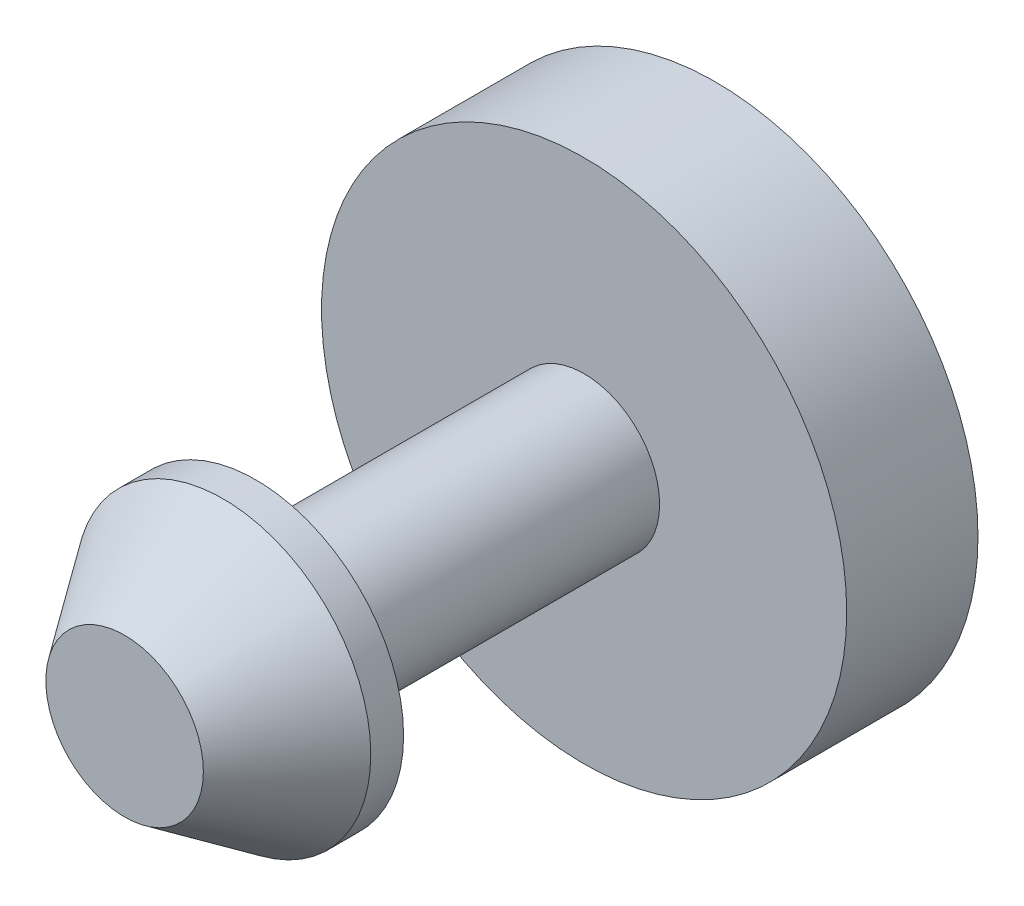
ISO-10303-21;
HEADER;
FILE_DESCRIPTION(('STEP AP214'),'2;1');
FILE_NAME('part.step','',(''),(''),'','','');
FILE_SCHEMA(('AUTOMOTIVE_DESIGN { 1 0 10303 214 1 1 1 1 }'));
ENDSEC;
DATA;
#1=APPLICATION_CONTEXT('core data for automotive mechanical design processes');
#2=APPLICATION_PROTOCOL_DEFINITION('international standard','automotive_design',2000,#1);
#3=PRODUCT_CONTEXT('',#1,'mechanical');
#4=PRODUCT('Part','Part','',(#3));
#5=PRODUCT_RELATED_PRODUCT_CATEGORY('part','',(#4));
#6=PRODUCT_DEFINITION_FORMATION('','',#4);
#7=PRODUCT_DEFINITION_CONTEXT('part definition',#1,'design');
#8=PRODUCT_DEFINITION('design','',#6,#7);
#9=PRODUCT_DEFINITION_SHAPE('','',#8);
#10=(LENGTH_UNIT() NAMED_UNIT(*) SI_UNIT(.MILLI.,.METRE.));
#11=(NAMED_UNIT(*) PLANE_ANGLE_UNIT() SI_UNIT($,.RADIAN.));
#12=(NAMED_UNIT(*) SI_UNIT($,.STERADIAN.) SOLID_ANGLE_UNIT());
#13=UNCERTAINTY_MEASURE_WITH_UNIT(LENGTH_MEASURE(1.E-05),#10,'distance_accuracy_value','');
#14=(GEOMETRIC_REPRESENTATION_CONTEXT(3) GLOBAL_UNCERTAINTY_ASSIGNED_CONTEXT((#13)) GLOBAL_UNIT_ASSIGNED_CONTEXT((#10,
#11,#12)) REPRESENTATION_CONTEXT('',''));
#15=CARTESIAN_POINT('',(0.,0.,0.));
#16=DIRECTION('',(0.,0.,1.));
#17=DIRECTION('',(1.,0.,0.));
#18=AXIS2_PLACEMENT_3D('',#15,#16,#17);
#19=CARTESIAN_POINT('',(0.,0.,2.));
#20=DIRECTION('',(0.,0.,-1.));
#21=DIRECTION('',(-1.,0.,0.));
#22=AXIS2_PLACEMENT_3D('',#19,#20,#21);
#23=CYLINDRICAL_SURFACE('',#22,4.);
#24=CARTESIAN_POINT('',(0.,0.,2.));
#25=DIRECTION('',(0.,0.,1.));
#26=DIRECTION('',(1.,0.,0.));
#27=AXIS2_PLACEMENT_3D('',#24,#25,#26);
#28=CIRCLE('',#27,4.);
#29=CARTESIAN_POINT('',(4.,0.,2.));
#30=VERTEX_POINT('',#29);
#31=EDGE_CURVE('E45',#30,#30,#28,.T.);
#32=ORIENTED_EDGE('',*,*,#31,.F.);
#33=EDGE_LOOP('',(#32));
#34=FACE_BOUND('',#33,.T.);
#35=CARTESIAN_POINT('',(0.,0.,0.));
#36=DIRECTION('',(0.,0.,1.));
#37=DIRECTION('',(1.,0.,0.));
#38=AXIS2_PLACEMENT_3D('',#35,#36,#37);
#39=CIRCLE('',#38,4.);
#40=CARTESIAN_POINT('',(4.,0.,0.));
#41=VERTEX_POINT('',#40);
#42=EDGE_CURVE('E40',#41,#41,#39,.T.);
#43=ORIENTED_EDGE('',*,*,#42,.T.);
#44=EDGE_LOOP('',(#43));
#45=FACE_BOUND('',#44,.T.);
#46=ADVANCED_FACE('F37',(#34,#45),#23,.T.);
#47=CARTESIAN_POINT('',(0.,0.,2.));
#48=DIRECTION('',(0.,0.,1.));
#49=DIRECTION('',(1.,0.,0.));
#50=AXIS2_PLACEMENT_3D('',#47,#48,#49);
#51=PLANE('',#50);
#52=CARTESIAN_POINT('',(0.,0.,2.));
#53=DIRECTION('',(0.,0.,1.));
#54=DIRECTION('',(1.,0.,0.));
#55=AXIS2_PLACEMENT_3D('',#52,#53,#54);
#56=CIRCLE('',#55,1.15);
#57=CARTESIAN_POINT('',(1.15,0.,2.));
#58=VERTEX_POINT('',#57);
#59=EDGE_CURVE('E10',#58,#58,#56,.T.);
#60=ORIENTED_EDGE('',*,*,#59,.F.);
#61=EDGE_LOOP('',(#60));
#62=FACE_BOUND('',#61,.T.);
#63=ORIENTED_EDGE('',*,*,#31,.T.);
#64=EDGE_LOOP('',(#63));
#65=FACE_BOUND('',#64,.T.);
#66=ADVANCED_FACE('F91',(#62,#65),#51,.T.);
#67=CARTESIAN_POINT('',(0.,0.,0.));
#68=DIRECTION('',(0.,0.,1.));
#69=DIRECTION('',(1.,0.,0.));
#70=AXIS2_PLACEMENT_3D('',#67,#68,#69);
#71=PLANE('',#70);
#72=ORIENTED_EDGE('',*,*,#42,.F.);
#73=EDGE_LOOP('',(#72));
#74=FACE_BOUND('',#73,.T.);
#75=ADVANCED_FACE('F96',(#74),#71,.F.);
#76=CARTESIAN_POINT('',(0.,0.,7.));
#77=DIRECTION('',(0.,0.,-1.));
#78=DIRECTION('',(-1.,0.,0.));
#79=AXIS2_PLACEMENT_3D('',#76,#77,#78);
#80=CYLINDRICAL_SURFACE('',#79,1.15);
#81=CARTESIAN_POINT('',(0.,0.,7.));
#82=DIRECTION('',(0.,0.,1.));
#83=DIRECTION('',(1.,0.,0.));
#84=AXIS2_PLACEMENT_3D('',#81,#82,#83);
#85=CIRCLE('',#84,1.15);
#86=CARTESIAN_POINT('',(1.15,0.,7.));
#87=VERTEX_POINT('',#86);
#88=EDGE_CURVE('E52',#87,#87,#85,.T.);
#89=ORIENTED_EDGE('',*,*,#88,.F.);
#90=EDGE_LOOP('',(#89));
#91=FACE_BOUND('',#90,.T.);
#92=ORIENTED_EDGE('',*,*,#59,.T.);
#93=EDGE_LOOP('',(#92));
#94=FACE_BOUND('',#93,.T.);
#95=ADVANCED_FACE('F81',(#91,#94),#80,.T.);
#96=CARTESIAN_POINT('',(0.,0.,7.5));
#97=DIRECTION('',(0.,0.,-1.));
#98=DIRECTION('',(-1.,0.,0.));
#99=AXIS2_PLACEMENT_3D('',#96,#97,#98);
#100=CYLINDRICAL_SURFACE('',#99,2.25);
#101=CARTESIAN_POINT('',(0.,0.,7.5));
#102=DIRECTION('',(0.,0.,1.));
#103=DIRECTION('',(1.,0.,0.));
#104=AXIS2_PLACEMENT_3D('',#101,#102,#103);
#105=CIRCLE('',#104,2.25);
#106=CARTESIAN_POINT('',(2.25,0.,7.5));
#107=VERTEX_POINT('',#106);
#108=EDGE_CURVE('E56',#107,#107,#105,.T.);
#109=ORIENTED_EDGE('',*,*,#108,.F.);
#110=EDGE_LOOP('',(#109));
#111=FACE_BOUND('',#110,.T.);
#112=CARTESIAN_POINT('',(0.,0.,7.));
#113=DIRECTION('',(0.,0.,1.));
#114=DIRECTION('',(1.,0.,0.));
#115=AXIS2_PLACEMENT_3D('',#112,#113,#114);
#116=CIRCLE('',#115,2.25);
#117=CARTESIAN_POINT('',(2.25,0.,7.));
#118=VERTEX_POINT('',#117);
#119=EDGE_CURVE('E57',#118,#118,#116,.T.);
#120=ORIENTED_EDGE('',*,*,#119,.T.);
#121=EDGE_LOOP('',(#120));
#122=FACE_BOUND('',#121,.T.);
#123=ADVANCED_FACE('F78',(#111,#122),#100,.T.);
#124=CARTESIAN_POINT('',(0.,0.,7.));
#125=DIRECTION('',(0.,0.,1.));
#126=DIRECTION('',(1.,0.,0.));
#127=AXIS2_PLACEMENT_3D('',#124,#125,#126);
#128=PLANE('',#127);
#129=ORIENTED_EDGE('',*,*,#88,.T.);
#130=EDGE_LOOP('',(#129));
#131=FACE_BOUND('',#130,.T.);
#132=ORIENTED_EDGE('',*,*,#119,.F.);
#133=EDGE_LOOP('',(#132));
#134=FACE_BOUND('',#133,.T.);
#135=ADVANCED_FACE('F74',(#131,#134),#128,.F.);
#136=CARTESIAN_POINT('',(0.,0.,7.5));
#137=DIRECTION('',(0.,0.,-1.));
#138=DIRECTION('',(1.,0.,0.));
#139=AXIS2_PLACEMENT_3D('',#136,#137,#138);
#140=CONICAL_SURFACE('',#139,2.25,0.610865238198017);
#141=CARTESIAN_POINT('',(0.,0.,9.));
#142=DIRECTION('',(0.,0.,1.));
#143=DIRECTION('',(1.,0.,0.));
#144=AXIS2_PLACEMENT_3D('',#141,#142,#143);
#145=CIRCLE('',#144,1.19968869268543);
#146=CARTESIAN_POINT('',(1.19968869268543,0.,9.));
#147=VERTEX_POINT('',#146);
#148=EDGE_CURVE('E61',#147,#147,#145,.T.);
#149=ORIENTED_EDGE('',*,*,#148,.F.);
#150=EDGE_LOOP('',(#149));
#151=FACE_BOUND('',#150,.T.);
#152=ORIENTED_EDGE('',*,*,#108,.T.);
#153=EDGE_LOOP('',(#152));
#154=FACE_BOUND('',#153,.T.);
#155=ADVANCED_FACE('F71',(#151,#154),#140,.T.);
#156=CARTESIAN_POINT('',(0.,0.,9.));
#157=DIRECTION('',(0.,0.,1.));
#158=DIRECTION('',(1.,0.,0.));
#159=AXIS2_PLACEMENT_3D('',#156,#157,#158);
#160=PLANE('',#159);
#161=ORIENTED_EDGE('',*,*,#148,.T.);
#162=EDGE_LOOP('',(#161));
#163=FACE_BOUND('',#162,.T.);
#164=ADVANCED_FACE('F69',(#163),#160,.T.);
#165=CLOSED_SHELL('',(#46,#66,#75,#95,#123,#135,#155,#164));
#166=MANIFOLD_SOLID_BREP('B2',#165);
#167=ADVANCED_BREP_SHAPE_REPRESENTATION('',(#18,#166),#14);
#168=SHAPE_DEFINITION_REPRESENTATION(#9,#167);
ENDSEC;
END-ISO-10303-21;
